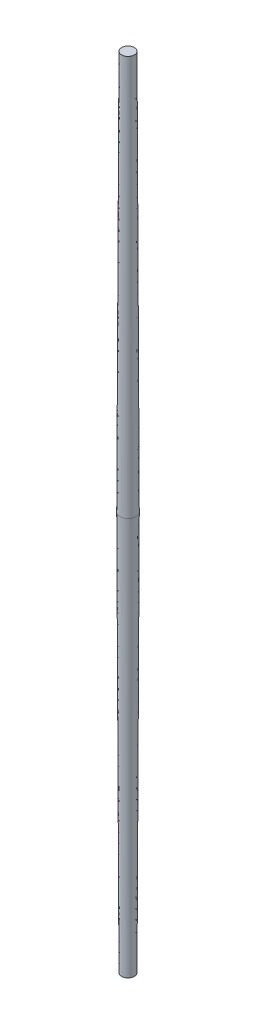
ISO-10303-21;
HEADER;
FILE_DESCRIPTION(('STEP AP214'),'2;1');
FILE_NAME('part.step','',(''),(''),'','','');
FILE_SCHEMA(('AUTOMOTIVE_DESIGN { 1 0 10303 214 1 1 1 1 }'));
ENDSEC;
DATA;
#1=APPLICATION_CONTEXT('core data for automotive mechanical design processes');
#2=APPLICATION_PROTOCOL_DEFINITION('international standard','automotive_design',2000,#1);
#3=PRODUCT_CONTEXT('',#1,'mechanical');
#4=PRODUCT('Part','Part','',(#3));
#5=PRODUCT_RELATED_PRODUCT_CATEGORY('part','',(#4));
#6=PRODUCT_DEFINITION_FORMATION('','',#4);
#7=PRODUCT_DEFINITION_CONTEXT('part definition',#1,'design');
#8=PRODUCT_DEFINITION('design','',#6,#7);
#9=PRODUCT_DEFINITION_SHAPE('','',#8);
#10=(LENGTH_UNIT() NAMED_UNIT(*) SI_UNIT(.MILLI.,.METRE.));
#11=(NAMED_UNIT(*) PLANE_ANGLE_UNIT() SI_UNIT($,.RADIAN.));
#12=(NAMED_UNIT(*) SI_UNIT($,.STERADIAN.) SOLID_ANGLE_UNIT());
#13=UNCERTAINTY_MEASURE_WITH_UNIT(LENGTH_MEASURE(1.E-05),#10,'distance_accuracy_value','');
#14=(GEOMETRIC_REPRESENTATION_CONTEXT(3) GLOBAL_UNCERTAINTY_ASSIGNED_CONTEXT((#13)) GLOBAL_UNIT_ASSIGNED_CONTEXT((#10,
#11,#12)) REPRESENTATION_CONTEXT('',''));
#15=CARTESIAN_POINT('',(0.,0.,0.));
#16=DIRECTION('',(0.,0.,1.));
#17=DIRECTION('',(1.,0.,0.));
#18=AXIS2_PLACEMENT_3D('',#15,#16,#17);
#19=CARTESIAN_POINT('',(0.,0.,0.));
#20=DIRECTION('',(0.,-1.,0.));
#21=DIRECTION('',(1.,0.,0.));
#22=AXIS2_PLACEMENT_3D('',#19,#20,#21);
#23=CONICAL_SURFACE('',#22,3.,0.00399997866687154);
#24=CARTESIAN_POINT('',(0.,150.,0.));
#25=DIRECTION('',(0.,1.,0.));
#26=DIRECTION('',(-1.,0.,0.));
#27=AXIS2_PLACEMENT_3D('',#24,#25,#26);
#28=CIRCLE('',#27,2.39999999999999);
#29=CARTESIAN_POINT('',(-2.39999999999998,150.,0.));
#30=VERTEX_POINT('',#29);
#31=EDGE_CURVE('E10',#30,#30,#28,.T.);
#32=ORIENTED_EDGE('',*,*,#31,.F.);
#33=EDGE_LOOP('',(#32));
#34=FACE_BOUND('',#33,.T.);
#35=CARTESIAN_POINT('',(0.,0.,0.));
#36=DIRECTION('',(0.,1.,0.));
#37=DIRECTION('',(-1.,0.,0.));
#38=AXIS2_PLACEMENT_3D('',#35,#36,#37);
#39=CIRCLE('',#38,3.);
#40=CARTESIAN_POINT('',(-3.,0.,0.));
#41=VERTEX_POINT('',#40);
#42=EDGE_CURVE('E39',#41,#41,#39,.T.);
#43=ORIENTED_EDGE('',*,*,#42,.T.);
#44=EDGE_LOOP('',(#43));
#45=FACE_BOUND('',#44,.T.);
#46=ADVANCED_FACE('F33',(#34,#45),#23,.T.);
#47=CARTESIAN_POINT('',(2.4,150.,0.));
#48=DIRECTION('',(0.,-1.,0.));
#49=DIRECTION('',(1.,0.,0.));
#50=AXIS2_PLACEMENT_3D('',#47,#48,#49);
#51=PLANE('',#50);
#52=ORIENTED_EDGE('',*,*,#31,.T.);
#53=EDGE_LOOP('',(#52));
#54=FACE_BOUND('',#53,.T.);
#55=ADVANCED_FACE('F59',(#54),#51,.F.);
#56=CARTESIAN_POINT('',(0.,0.,0.));
#57=DIRECTION('',(0.,1.,0.));
#58=DIRECTION('',(1.,0.,0.));
#59=AXIS2_PLACEMENT_3D('',#56,#57,#58);
#60=CONICAL_SURFACE('',#59,3.,0.00399997866687154);
#61=CARTESIAN_POINT('',(0.,-150.,0.));
#62=DIRECTION('',(0.,1.,0.));
#63=DIRECTION('',(-1.,0.,0.));
#64=AXIS2_PLACEMENT_3D('',#61,#62,#63);
#65=CIRCLE('',#64,2.39999999999999);
#66=CARTESIAN_POINT('',(-2.4,-150.,0.));
#67=VERTEX_POINT('',#66);
#68=EDGE_CURVE('E43',#67,#67,#65,.T.);
#69=ORIENTED_EDGE('',*,*,#68,.T.);
#70=EDGE_LOOP('',(#69));
#71=FACE_BOUND('',#70,.T.);
#72=ORIENTED_EDGE('',*,*,#42,.F.);
#73=EDGE_LOOP('',(#72));
#74=FACE_BOUND('',#73,.T.);
#75=ADVANCED_FACE('F50',(#71,#74),#60,.T.);
#76=CARTESIAN_POINT('',(2.39999999999998,-150.,0.));
#77=DIRECTION('',(0.,1.,0.));
#78=DIRECTION('',(1.,0.,0.));
#79=AXIS2_PLACEMENT_3D('',#76,#77,#78);
#80=PLANE('',#79);
#81=ORIENTED_EDGE('',*,*,#68,.F.);
#82=EDGE_LOOP('',(#81));
#83=FACE_BOUND('',#82,.T.);
#84=ADVANCED_FACE('F53',(#83),#80,.F.);
#85=CLOSED_SHELL('',(#46,#55,#75,#84));
#86=MANIFOLD_SOLID_BREP('B2',#85);
#87=ADVANCED_BREP_SHAPE_REPRESENTATION('',(#18,#86),#14);
#88=SHAPE_DEFINITION_REPRESENTATION(#9,#87);
ENDSEC;
END-ISO-10303-21;
